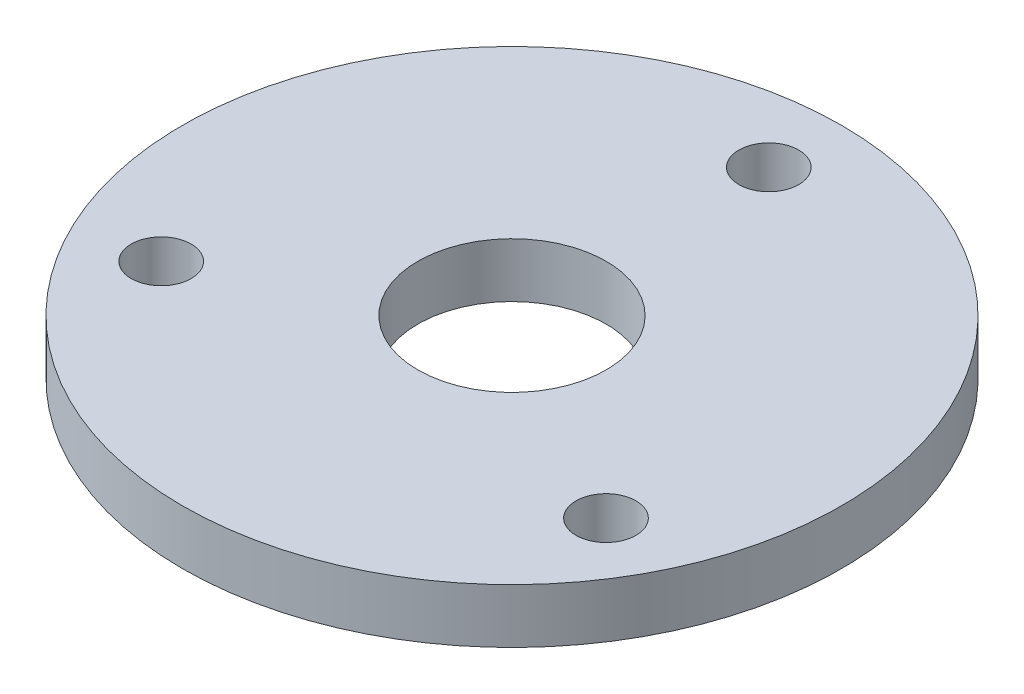
ISO-10303-21;
HEADER;
FILE_DESCRIPTION(('STEP AP214'),'2;1');
FILE_NAME('part.step','',(''),(''),'','','');
FILE_SCHEMA(('AUTOMOTIVE_DESIGN { 1 0 10303 214 1 1 1 1 }'));
ENDSEC;
DATA;
#1=APPLICATION_CONTEXT('core data for automotive mechanical design processes');
#2=APPLICATION_PROTOCOL_DEFINITION('international standard','automotive_design',2000,#1);
#3=PRODUCT_CONTEXT('',#1,'mechanical');
#4=PRODUCT('Part','Part','',(#3));
#5=PRODUCT_RELATED_PRODUCT_CATEGORY('part','',(#4));
#6=PRODUCT_DEFINITION_FORMATION('','',#4);
#7=PRODUCT_DEFINITION_CONTEXT('part definition',#1,'design');
#8=PRODUCT_DEFINITION('design','',#6,#7);
#9=PRODUCT_DEFINITION_SHAPE('','',#8);
#10=(LENGTH_UNIT() NAMED_UNIT(*) SI_UNIT(.MILLI.,.METRE.));
#11=(NAMED_UNIT(*) PLANE_ANGLE_UNIT() SI_UNIT($,.RADIAN.));
#12=(NAMED_UNIT(*) SI_UNIT($,.STERADIAN.) SOLID_ANGLE_UNIT());
#13=UNCERTAINTY_MEASURE_WITH_UNIT(LENGTH_MEASURE(1.E-05),#10,'distance_accuracy_value','');
#14=(GEOMETRIC_REPRESENTATION_CONTEXT(3) GLOBAL_UNCERTAINTY_ASSIGNED_CONTEXT((#13)) GLOBAL_UNIT_ASSIGNED_CONTEXT((#10,
#11,#12)) REPRESENTATION_CONTEXT('',''));
#15=CARTESIAN_POINT('',(0.,0.,0.));
#16=DIRECTION('',(0.,0.,1.));
#17=DIRECTION('',(1.,0.,0.));
#18=AXIS2_PLACEMENT_3D('',#15,#16,#17);
#19=CARTESIAN_POINT('',(933.152542372881,6.36,-445.016949152542));
#20=DIRECTION('',(0.,-1.,0.));
#21=DIRECTION('',(0.,0.,-1.));
#22=AXIS2_PLACEMENT_3D('',#19,#20,#21);
#23=CYLINDRICAL_SURFACE('',#22,38.4999999999999);
#24=CARTESIAN_POINT('',(933.152542372881,6.36,-445.016949152542));
#25=DIRECTION('',(0.,1.,0.));
#26=DIRECTION('',(0.,0.,1.));
#27=AXIS2_PLACEMENT_3D('',#24,#25,#26);
#28=CIRCLE('',#27,38.4999999999999);
#29=CARTESIAN_POINT('',(933.152542372881,6.36,-483.516949152542));
#30=VERTEX_POINT('',#29);
#31=EDGE_CURVE('E10',#30,#30,#28,.T.);
#32=CARTESIAN_POINT('',(933.152542372881,0.,-445.016949152542));
#33=DIRECTION('',(0.,1.,0.));
#34=DIRECTION('',(0.,0.,1.));
#35=AXIS2_PLACEMENT_3D('',#32,#33,#34);
#36=CIRCLE('',#35,38.4999999999999);
#37=CARTESIAN_POINT('',(933.152542372881,0.,-483.516949152542));
#38=VERTEX_POINT('',#37);
#39=EDGE_CURVE('E40',#38,#38,#36,.T.);
#40=CARTESIAN_POINT('',(933.152542372881,6.36,-483.516949152542));
#41=CARTESIAN_POINT('',(933.152542372881,6.29375,-483.516949152542));
#42=CARTESIAN_POINT('',(933.152542372881,6.2275,-483.516949152542));
#43=CARTESIAN_POINT('',(933.152542372881,6.095,-483.516949152542));
#44=CARTESIAN_POINT('',(933.152542372881,6.02875,-483.516949152542));
#45=CARTESIAN_POINT('',(933.152542372881,5.89625,-483.516949152542));
#46=CARTESIAN_POINT('',(933.152542372881,5.83,-483.516949152542));
#47=CARTESIAN_POINT('',(933.152542372881,5.6975,-483.516949152542));
#48=CARTESIAN_POINT('',(933.152542372881,5.63125,-483.516949152542));
#49=CARTESIAN_POINT('',(933.152542372881,5.49875,-483.516949152542));
#50=CARTESIAN_POINT('',(933.152542372881,5.4325,-483.516949152542));
#51=CARTESIAN_POINT('',(933.152542372881,5.3,-483.516949152542));
#52=CARTESIAN_POINT('',(933.152542372881,5.23375,-483.516949152542));
#53=CARTESIAN_POINT('',(933.152542372881,5.10125,-483.516949152542));
#54=CARTESIAN_POINT('',(933.152542372881,5.035,-483.516949152542));
#55=CARTESIAN_POINT('',(933.152542372881,4.9025,-483.516949152542));
#56=CARTESIAN_POINT('',(933.152542372881,4.83625,-483.516949152542));
#57=CARTESIAN_POINT('',(933.152542372881,4.70375,-483.516949152542));
#58=CARTESIAN_POINT('',(933.152542372881,4.6375,-483.516949152542));
#59=CARTESIAN_POINT('',(933.152542372881,4.505,-483.516949152542));
#60=CARTESIAN_POINT('',(933.152542372881,4.43875,-483.516949152542));
#61=CARTESIAN_POINT('',(933.152542372881,4.30625,-483.516949152542));
#62=CARTESIAN_POINT('',(933.152542372881,4.24,-483.516949152542));
#63=CARTESIAN_POINT('',(933.152542372881,4.1075,-483.516949152542));
#64=CARTESIAN_POINT('',(933.152542372881,4.04125,-483.516949152542));
#65=CARTESIAN_POINT('',(933.152542372881,3.90875,-483.516949152542));
#66=CARTESIAN_POINT('',(933.152542372881,3.8425,-483.516949152542));
#67=CARTESIAN_POINT('',(933.152542372881,3.71,-483.516949152542));
#68=CARTESIAN_POINT('',(933.152542372881,3.64375,-483.516949152542));
#69=CARTESIAN_POINT('',(933.152542372881,3.51125,-483.516949152542));
#70=CARTESIAN_POINT('',(933.152542372881,3.445,-483.516949152542));
#71=CARTESIAN_POINT('',(933.152542372881,3.3125,-483.516949152542));
#72=CARTESIAN_POINT('',(933.152542372881,3.24625,-483.516949152542));
#73=CARTESIAN_POINT('',(933.152542372881,3.11375,-483.516949152542));
#74=CARTESIAN_POINT('',(933.152542372881,3.0475,-483.516949152542));
#75=CARTESIAN_POINT('',(933.152542372881,2.915,-483.516949152542));
#76=CARTESIAN_POINT('',(933.152542372881,2.84875,-483.516949152542));
#77=CARTESIAN_POINT('',(933.152542372881,2.71625,-483.516949152542));
#78=CARTESIAN_POINT('',(933.152542372881,2.65,-483.516949152542));
#79=CARTESIAN_POINT('',(933.152542372881,2.5175,-483.516949152542));
#80=CARTESIAN_POINT('',(933.152542372881,2.45125,-483.516949152542));
#81=CARTESIAN_POINT('',(933.152542372881,2.31875,-483.516949152542));
#82=CARTESIAN_POINT('',(933.152542372881,2.2525,-483.516949152542));
#83=CARTESIAN_POINT('',(933.152542372881,2.12,-483.516949152542));
#84=CARTESIAN_POINT('',(933.152542372881,2.05375,-483.516949152542));
#85=CARTESIAN_POINT('',(933.152542372881,1.92125,-483.516949152542));
#86=CARTESIAN_POINT('',(933.152542372881,1.855,-483.516949152542));
#87=CARTESIAN_POINT('',(933.152542372881,1.7225,-483.516949152542));
#88=CARTESIAN_POINT('',(933.152542372881,1.65625,-483.516949152542));
#89=CARTESIAN_POINT('',(933.152542372881,1.52375,-483.516949152542));
#90=CARTESIAN_POINT('',(933.152542372881,1.4575,-483.516949152542));
#91=CARTESIAN_POINT('',(933.152542372881,1.325,-483.516949152542));
#92=CARTESIAN_POINT('',(933.152542372881,1.25875,-483.516949152542));
#93=CARTESIAN_POINT('',(933.152542372881,1.12625,-483.516949152542));
#94=CARTESIAN_POINT('',(933.152542372881,1.06,-483.516949152542));
#95=CARTESIAN_POINT('',(933.152542372881,0.9275,-483.516949152542));
#96=CARTESIAN_POINT('',(933.152542372881,0.86125,-483.516949152542));
#97=CARTESIAN_POINT('',(933.152542372881,0.72875,-483.516949152542));
#98=CARTESIAN_POINT('',(933.152542372881,0.6625,-483.516949152542));
#99=CARTESIAN_POINT('',(933.152542372881,0.53,-483.516949152542));
#100=CARTESIAN_POINT('',(933.152542372881,0.46375,-483.516949152542));
#101=CARTESIAN_POINT('',(933.152542372881,0.33125,-483.516949152542));
#102=CARTESIAN_POINT('',(933.152542372881,0.265,-483.516949152542));
#103=CARTESIAN_POINT('',(933.152542372881,0.1325,-483.516949152542));
#104=CARTESIAN_POINT('',(933.152542372881,0.0662500000000001,-483.516949152542));
#105=CARTESIAN_POINT('',(933.152542372881,0.,-483.516949152542));
#106=B_SPLINE_CURVE_WITH_KNOTS('',3,(#40,#41,#42,#43,#44,#45,#46,#47,#48,#49,#50,#51,#52,#53,
#54,#55,#56,#57,#58,#59,#60,#61,#62,#63,#64,#65,#66,#67,#68,#69,#70,#71,#72,#73,#74,#75,#76,#77,
#78,#79,#80,#81,#82,#83,#84,#85,#86,#87,#88,#89,#90,#91,#92,#93,#94,#95,#96,#97,#98,#99,#100,
#101,#102,#103,#104,#105),.UNSPECIFIED.,.F.,.F.,(4,2,2,2,2,2,2,2,2,2,2,2,2,2,2,2,2,2,2,2,2,2,2,
2,2,2,2,2,2,2,2,2,4),(0.,0.198749999999999,0.397499999999999,0.59625,0.795,0.99375,1.1925,
1.39125,1.59,1.78875,1.9875,2.18625,2.385,2.58375,2.7825,2.98125,3.18,3.37875,3.5775,3.77625,
3.975,4.17375,4.3725,4.57125,4.77,4.96875,5.1675,5.36625,5.565,5.76375,5.9625,6.16125,6.36),.UNSPECIFIED.);
#107=EDGE_CURVE('BSEAM37',#30,#38,#106,.T.);
#108=ORIENTED_EDGE('',*,*,#31,.F.);
#109=ORIENTED_EDGE('',*,*,#39,.T.);
#110=ORIENTED_EDGE('',*,*,#107,.T.);
#111=ORIENTED_EDGE('',*,*,#107,.F.);
#112=EDGE_LOOP('',(#108,#110,#109,#111));
#113=FACE_BOUND('',#112,.T.);
#114=ADVANCED_FACE('F37',(#113),#23,.T.);
#115=CARTESIAN_POINT('',(933.152542372881,6.36,-445.016949152542));
#116=DIRECTION('',(0.,1.,0.));
#117=DIRECTION('',(0.,0.,1.));
#118=AXIS2_PLACEMENT_3D('',#115,#116,#117);
#119=PLANE('',#118);
#120=CARTESIAN_POINT('',(933.152542372881,6.36,-445.016949152542));
#121=DIRECTION('',(0.,1.,0.));
#122=DIRECTION('',(0.,0.,1.));
#123=AXIS2_PLACEMENT_3D('',#120,#121,#122);
#124=CIRCLE('',#123,11.);
#125=CARTESIAN_POINT('',(933.152542372881,6.36,-434.016949152542));
#126=VERTEX_POINT('',#125);
#127=EDGE_CURVE('E75',#126,#126,#124,.T.);
#128=ORIENTED_EDGE('',*,*,#127,.F.);
#129=EDGE_LOOP('',(#128));
#130=FACE_BOUND('',#129,.T.);
#131=CARTESIAN_POINT('',(907.171780259348,6.36,-430.016949152542));
#132=DIRECTION('',(0.,1.,0.));
#133=DIRECTION('',(0.,0.,1.));
#134=AXIS2_PLACEMENT_3D('',#131,#132,#133);
#135=CIRCLE('',#134,3.49999999999985);
#136=CARTESIAN_POINT('',(907.171780259348,6.36,-426.516949152543));
#137=VERTEX_POINT('',#136);
#138=EDGE_CURVE('E59',#137,#137,#135,.T.);
#139=ORIENTED_EDGE('',*,*,#138,.F.);
#140=EDGE_LOOP('',(#139));
#141=FACE_BOUND('',#140,.T.);
#142=CARTESIAN_POINT('',(959.133304486414,6.36,-430.016949152542));
#143=DIRECTION('',(0.,1.,0.));
#144=DIRECTION('',(0.,0.,1.));
#145=AXIS2_PLACEMENT_3D('',#142,#143,#144);
#146=CIRCLE('',#145,3.49999999999997);
#147=CARTESIAN_POINT('',(959.133304486414,6.36,-426.516949152543));
#148=VERTEX_POINT('',#147);
#149=EDGE_CURVE('E68',#148,#148,#146,.T.);
#150=ORIENTED_EDGE('',*,*,#149,.F.);
#151=EDGE_LOOP('',(#150));
#152=FACE_BOUND('',#151,.T.);
#153=CARTESIAN_POINT('',(933.152542372881,6.36,-475.016949152542));
#154=DIRECTION('',(0.,1.,0.));
#155=DIRECTION('',(0.,0.,1.));
#156=AXIS2_PLACEMENT_3D('',#153,#154,#155);
#157=CIRCLE('',#156,3.49999999999997);
#158=CARTESIAN_POINT('',(933.152542372881,6.36,-471.516949152543));
#159=VERTEX_POINT('',#158);
#160=EDGE_CURVE('E51',#159,#159,#157,.T.);
#161=ORIENTED_EDGE('',*,*,#160,.F.);
#162=EDGE_LOOP('',(#161));
#163=FACE_BOUND('',#162,.T.);
#164=ORIENTED_EDGE('',*,*,#31,.T.);
#165=EDGE_LOOP('',(#164));
#166=FACE_BOUND('',#165,.T.);
#167=ADVANCED_FACE('F93',(#130,#141,#152,#163,#166),#119,.T.);
#168=CARTESIAN_POINT('',(933.152542372881,0.,-445.016949152542));
#169=DIRECTION('',(0.,1.,0.));
#170=DIRECTION('',(0.,0.,1.));
#171=AXIS2_PLACEMENT_3D('',#168,#169,#170);
#172=PLANE('',#171);
#173=CARTESIAN_POINT('',(933.152542372881,0.,-445.016949152542));
#174=DIRECTION('',(0.,1.,0.));
#175=DIRECTION('',(0.,0.,1.));
#176=AXIS2_PLACEMENT_3D('',#173,#174,#175);
#177=CIRCLE('',#176,11.);
#178=CARTESIAN_POINT('',(933.152542372881,0.,-434.016949152542));
#179=VERTEX_POINT('',#178);
#180=EDGE_CURVE('E64',#179,#179,#177,.T.);
#181=ORIENTED_EDGE('',*,*,#180,.T.);
#182=EDGE_LOOP('',(#181));
#183=FACE_BOUND('',#182,.T.);
#184=CARTESIAN_POINT('',(907.171780259348,0.,-430.016949152542));
#185=DIRECTION('',(0.,1.,0.));
#186=DIRECTION('',(0.,0.,1.));
#187=AXIS2_PLACEMENT_3D('',#184,#185,#186);
#188=CIRCLE('',#187,3.49999999999985);
#189=CARTESIAN_POINT('',(907.171780259348,0.,-426.516949152543));
#190=VERTEX_POINT('',#189);
#191=EDGE_CURVE('E63',#190,#190,#188,.T.);
#192=ORIENTED_EDGE('',*,*,#191,.T.);
#193=EDGE_LOOP('',(#192));
#194=FACE_BOUND('',#193,.T.);
#195=CARTESIAN_POINT('',(959.133304486414,0.,-430.016949152542));
#196=DIRECTION('',(0.,1.,0.));
#197=DIRECTION('',(0.,0.,1.));
#198=AXIS2_PLACEMENT_3D('',#195,#196,#197);
#199=CIRCLE('',#198,3.49999999999997);
#200=CARTESIAN_POINT('',(959.133304486414,0.,-426.516949152543));
#201=VERTEX_POINT('',#200);
#202=EDGE_CURVE('E55',#201,#201,#199,.T.);
#203=ORIENTED_EDGE('',*,*,#202,.T.);
#204=EDGE_LOOP('',(#203));
#205=FACE_BOUND('',#204,.T.);
#206=CARTESIAN_POINT('',(933.152542372881,0.,-475.016949152542));
#207=DIRECTION('',(0.,1.,0.));
#208=DIRECTION('',(0.,0.,1.));
#209=AXIS2_PLACEMENT_3D('',#206,#207,#208);
#210=CIRCLE('',#209,3.49999999999997);
#211=CARTESIAN_POINT('',(933.152542372881,0.,-471.516949152543));
#212=VERTEX_POINT('',#211);
#213=EDGE_CURVE('E49',#212,#212,#210,.T.);
#214=ORIENTED_EDGE('',*,*,#213,.T.);
#215=EDGE_LOOP('',(#214));
#216=FACE_BOUND('',#215,.T.);
#217=ORIENTED_EDGE('',*,*,#39,.F.);
#218=EDGE_LOOP('',(#217));
#219=FACE_BOUND('',#218,.T.);
#220=ADVANCED_FACE('F83',(#183,#194,#205,#216,#219),#172,.F.);
#221=CARTESIAN_POINT('',(933.152542372881,0.,-475.016949152542));
#222=DIRECTION('',(0.,1.,0.));
#223=DIRECTION('',(0.,0.,1.));
#224=AXIS2_PLACEMENT_3D('',#221,#222,#223);
#225=CYLINDRICAL_SURFACE('',#224,3.49999999999997);
#226=CARTESIAN_POINT('',(933.152542372881,0.,-471.516949152543));
#227=CARTESIAN_POINT('',(933.152542372881,0.0662499999999999,-471.516949152543));
#228=CARTESIAN_POINT('',(933.152542372881,0.1325,-471.516949152543));
#229=CARTESIAN_POINT('',(933.152542372881,0.265,-471.516949152543));
#230=CARTESIAN_POINT('',(933.152542372881,0.33125,-471.516949152543));
#231=CARTESIAN_POINT('',(933.152542372881,0.46375,-471.516949152543));
#232=CARTESIAN_POINT('',(933.152542372881,0.53,-471.516949152543));
#233=CARTESIAN_POINT('',(933.152542372881,0.6625,-471.516949152543));
#234=CARTESIAN_POINT('',(933.152542372881,0.72875,-471.516949152543));
#235=CARTESIAN_POINT('',(933.152542372881,0.86125,-471.516949152543));
#236=CARTESIAN_POINT('',(933.152542372881,0.9275,-471.516949152543));
#237=CARTESIAN_POINT('',(933.152542372881,1.06,-471.516949152543));
#238=CARTESIAN_POINT('',(933.152542372881,1.12625,-471.516949152543));
#239=CARTESIAN_POINT('',(933.152542372881,1.25875,-471.516949152543));
#240=CARTESIAN_POINT('',(933.152542372881,1.325,-471.516949152543));
#241=CARTESIAN_POINT('',(933.152542372881,1.4575,-471.516949152543));
#242=CARTESIAN_POINT('',(933.152542372881,1.52375,-471.516949152543));
#243=CARTESIAN_POINT('',(933.152542372881,1.65625,-471.516949152543));
#244=CARTESIAN_POINT('',(933.152542372881,1.7225,-471.516949152543));
#245=CARTESIAN_POINT('',(933.152542372881,1.855,-471.516949152543));
#246=CARTESIAN_POINT('',(933.152542372881,1.92125,-471.516949152543));
#247=CARTESIAN_POINT('',(933.152542372881,2.05375,-471.516949152543));
#248=CARTESIAN_POINT('',(933.152542372881,2.12,-471.516949152543));
#249=CARTESIAN_POINT('',(933.152542372881,2.2525,-471.516949152543));
#250=CARTESIAN_POINT('',(933.152542372881,2.31875,-471.516949152543));
#251=CARTESIAN_POINT('',(933.152542372881,2.45125,-471.516949152543));
#252=CARTESIAN_POINT('',(933.152542372881,2.5175,-471.516949152543));
#253=CARTESIAN_POINT('',(933.152542372881,2.65,-471.516949152543));
#254=CARTESIAN_POINT('',(933.152542372881,2.71625,-471.516949152543));
#255=CARTESIAN_POINT('',(933.152542372881,2.84875,-471.516949152543));
#256=CARTESIAN_POINT('',(933.152542372881,2.915,-471.516949152543));
#257=CARTESIAN_POINT('',(933.152542372881,3.0475,-471.516949152543));
#258=CARTESIAN_POINT('',(933.152542372881,3.11375,-471.516949152543));
#259=CARTESIAN_POINT('',(933.152542372881,3.24625,-471.516949152543));
#260=CARTESIAN_POINT('',(933.152542372881,3.3125,-471.516949152543));
#261=CARTESIAN_POINT('',(933.152542372881,3.445,-471.516949152543));
#262=CARTESIAN_POINT('',(933.152542372881,3.51125,-471.516949152543));
#263=CARTESIAN_POINT('',(933.152542372881,3.64375,-471.516949152543));
#264=CARTESIAN_POINT('',(933.152542372881,3.71,-471.516949152543));
#265=CARTESIAN_POINT('',(933.152542372881,3.8425,-471.516949152543));
#266=CARTESIAN_POINT('',(933.152542372881,3.90875,-471.516949152543));
#267=CARTESIAN_POINT('',(933.152542372881,4.04125,-471.516949152543));
#268=CARTESIAN_POINT('',(933.152542372881,4.1075,-471.516949152543));
#269=CARTESIAN_POINT('',(933.152542372881,4.24,-471.516949152543));
#270=CARTESIAN_POINT('',(933.152542372881,4.30625,-471.516949152543));
#271=CARTESIAN_POINT('',(933.152542372881,4.43875,-471.516949152543));
#272=CARTESIAN_POINT('',(933.152542372881,4.505,-471.516949152543));
#273=CARTESIAN_POINT('',(933.152542372881,4.6375,-471.516949152543));
#274=CARTESIAN_POINT('',(933.152542372881,4.70375,-471.516949152543));
#275=CARTESIAN_POINT('',(933.152542372881,4.83625,-471.516949152543));
#276=CARTESIAN_POINT('',(933.152542372881,4.9025,-471.516949152543));
#277=CARTESIAN_POINT('',(933.152542372881,5.035,-471.516949152543));
#278=CARTESIAN_POINT('',(933.152542372881,5.10125,-471.516949152543));
#279=CARTESIAN_POINT('',(933.152542372881,5.23375,-471.516949152543));
#280=CARTESIAN_POINT('',(933.152542372881,5.3,-471.516949152543));
#281=CARTESIAN_POINT('',(933.152542372881,5.4325,-471.516949152543));
#282=CARTESIAN_POINT('',(933.152542372881,5.49875,-471.516949152543));
#283=CARTESIAN_POINT('',(933.152542372881,5.63125,-471.516949152543));
#284=CARTESIAN_POINT('',(933.152542372881,5.6975,-471.516949152543));
#285=CARTESIAN_POINT('',(933.152542372881,5.83,-471.516949152543));
#286=CARTESIAN_POINT('',(933.152542372881,5.89625,-471.516949152543));
#287=CARTESIAN_POINT('',(933.152542372881,6.02875,-471.516949152543));
#288=CARTESIAN_POINT('',(933.152542372881,6.095,-471.516949152543));
#289=CARTESIAN_POINT('',(933.152542372881,6.2275,-471.516949152543));
#290=CARTESIAN_POINT('',(933.152542372881,6.29375,-471.516949152543));
#291=CARTESIAN_POINT('',(933.152542372881,6.36,-471.516949152543));
#292=B_SPLINE_CURVE_WITH_KNOTS('',3,(#226,#227,#228,#229,#230,#231,#232,#233,#234,#235,#236,
#237,#238,#239,#240,#241,#242,#243,#244,#245,#246,#247,#248,#249,#250,#251,#252,#253,#254,#255,
#256,#257,#258,#259,#260,#261,#262,#263,#264,#265,#266,#267,#268,#269,#270,#271,#272,#273,#274,
#275,#276,#277,#278,#279,#280,#281,#282,#283,#284,#285,#286,#287,#288,#289,#290,#291),
.UNSPECIFIED.,.F.,.F.,(4,2,2,2,2,2,2,2,2,2,2,2,2,2,2,2,2,2,2,2,2,2,2,2,2,2,2,2,2,2,2,2,4),(0.,
0.19875,0.3975,0.59625,0.795,0.99375,1.1925,1.39125,1.59,1.78875,1.9875,2.18625,2.385,2.58375,
2.7825,2.98125,3.18,3.37875,3.5775,3.77625,3.975,4.17375,4.3725,4.57125,4.77,4.96875,5.1675,
5.36625,5.565,5.76375,5.9625,6.16125,6.36),.UNSPECIFIED.);
#293=EDGE_CURVE('BSEAM103',#212,#159,#292,.T.);
#294=ORIENTED_EDGE('',*,*,#213,.F.);
#295=ORIENTED_EDGE('',*,*,#160,.T.);
#296=ORIENTED_EDGE('',*,*,#293,.T.);
#297=ORIENTED_EDGE('',*,*,#293,.F.);
#298=EDGE_LOOP('',(#294,#296,#295,#297));
#299=FACE_BOUND('',#298,.T.);
#300=ADVANCED_FACE('F103',(#299),#225,.F.);
#301=CARTESIAN_POINT('',(959.133304486414,0.,-430.016949152542));
#302=DIRECTION('',(0.,1.,0.));
#303=DIRECTION('',(0.,0.,1.));
#304=AXIS2_PLACEMENT_3D('',#301,#302,#303);
#305=CYLINDRICAL_SURFACE('',#304,3.49999999999997);
#306=CARTESIAN_POINT('',(959.133304486414,0.,-426.516949152543));
#307=CARTESIAN_POINT('',(959.133304486414,0.0662499999999999,-426.516949152543));
#308=CARTESIAN_POINT('',(959.133304486414,0.1325,-426.516949152543));
#309=CARTESIAN_POINT('',(959.133304486414,0.265,-426.516949152543));
#310=CARTESIAN_POINT('',(959.133304486414,0.33125,-426.516949152543));
#311=CARTESIAN_POINT('',(959.133304486414,0.46375,-426.516949152543));
#312=CARTESIAN_POINT('',(959.133304486414,0.53,-426.516949152543));
#313=CARTESIAN_POINT('',(959.133304486414,0.6625,-426.516949152543));
#314=CARTESIAN_POINT('',(959.133304486414,0.72875,-426.516949152543));
#315=CARTESIAN_POINT('',(959.133304486414,0.86125,-426.516949152543));
#316=CARTESIAN_POINT('',(959.133304486414,0.9275,-426.516949152543));
#317=CARTESIAN_POINT('',(959.133304486414,1.06,-426.516949152543));
#318=CARTESIAN_POINT('',(959.133304486414,1.12625,-426.516949152543));
#319=CARTESIAN_POINT('',(959.133304486414,1.25875,-426.516949152543));
#320=CARTESIAN_POINT('',(959.133304486414,1.325,-426.516949152543));
#321=CARTESIAN_POINT('',(959.133304486414,1.4575,-426.516949152543));
#322=CARTESIAN_POINT('',(959.133304486414,1.52375,-426.516949152543));
#323=CARTESIAN_POINT('',(959.133304486414,1.65625,-426.516949152543));
#324=CARTESIAN_POINT('',(959.133304486414,1.7225,-426.516949152543));
#325=CARTESIAN_POINT('',(959.133304486414,1.855,-426.516949152543));
#326=CARTESIAN_POINT('',(959.133304486414,1.92125,-426.516949152543));
#327=CARTESIAN_POINT('',(959.133304486414,2.05375,-426.516949152543));
#328=CARTESIAN_POINT('',(959.133304486414,2.12,-426.516949152543));
#329=CARTESIAN_POINT('',(959.133304486414,2.2525,-426.516949152543));
#330=CARTESIAN_POINT('',(959.133304486414,2.31875,-426.516949152543));
#331=CARTESIAN_POINT('',(959.133304486414,2.45125,-426.516949152543));
#332=CARTESIAN_POINT('',(959.133304486414,2.5175,-426.516949152543));
#333=CARTESIAN_POINT('',(959.133304486414,2.65,-426.516949152543));
#334=CARTESIAN_POINT('',(959.133304486414,2.71625,-426.516949152543));
#335=CARTESIAN_POINT('',(959.133304486414,2.84875,-426.516949152543));
#336=CARTESIAN_POINT('',(959.133304486414,2.915,-426.516949152543));
#337=CARTESIAN_POINT('',(959.133304486414,3.0475,-426.516949152543));
#338=CARTESIAN_POINT('',(959.133304486414,3.11375,-426.516949152543));
#339=CARTESIAN_POINT('',(959.133304486414,3.24625,-426.516949152543));
#340=CARTESIAN_POINT('',(959.133304486414,3.3125,-426.516949152543));
#341=CARTESIAN_POINT('',(959.133304486414,3.445,-426.516949152543));
#342=CARTESIAN_POINT('',(959.133304486414,3.51125,-426.516949152543));
#343=CARTESIAN_POINT('',(959.133304486414,3.64375,-426.516949152543));
#344=CARTESIAN_POINT('',(959.133304486414,3.71,-426.516949152543));
#345=CARTESIAN_POINT('',(959.133304486414,3.8425,-426.516949152543));
#346=CARTESIAN_POINT('',(959.133304486414,3.90875,-426.516949152543));
#347=CARTESIAN_POINT('',(959.133304486414,4.04125,-426.516949152543));
#348=CARTESIAN_POINT('',(959.133304486414,4.1075,-426.516949152543));
#349=CARTESIAN_POINT('',(959.133304486414,4.24,-426.516949152543));
#350=CARTESIAN_POINT('',(959.133304486414,4.30625,-426.516949152543));
#351=CARTESIAN_POINT('',(959.133304486414,4.43875,-426.516949152543));
#352=CARTESIAN_POINT('',(959.133304486414,4.505,-426.516949152543));
#353=CARTESIAN_POINT('',(959.133304486414,4.6375,-426.516949152543));
#354=CARTESIAN_POINT('',(959.133304486414,4.70375,-426.516949152543));
#355=CARTESIAN_POINT('',(959.133304486414,4.83625,-426.516949152543));
#356=CARTESIAN_POINT('',(959.133304486414,4.9025,-426.516949152543));
#357=CARTESIAN_POINT('',(959.133304486414,5.035,-426.516949152543));
#358=CARTESIAN_POINT('',(959.133304486414,5.10125,-426.516949152543));
#359=CARTESIAN_POINT('',(959.133304486414,5.23375,-426.516949152543));
#360=CARTESIAN_POINT('',(959.133304486414,5.3,-426.516949152543));
#361=CARTESIAN_POINT('',(959.133304486414,5.4325,-426.516949152543));
#362=CARTESIAN_POINT('',(959.133304486414,5.49875,-426.516949152543));
#363=CARTESIAN_POINT('',(959.133304486414,5.63125,-426.516949152543));
#364=CARTESIAN_POINT('',(959.133304486414,5.6975,-426.516949152543));
#365=CARTESIAN_POINT('',(959.133304486414,5.83,-426.516949152543));
#366=CARTESIAN_POINT('',(959.133304486414,5.89625,-426.516949152543));
#367=CARTESIAN_POINT('',(959.133304486414,6.02875,-426.516949152543));
#368=CARTESIAN_POINT('',(959.133304486414,6.095,-426.516949152543));
#369=CARTESIAN_POINT('',(959.133304486414,6.2275,-426.516949152543));
#370=CARTESIAN_POINT('',(959.133304486414,6.29375,-426.516949152543));
#371=CARTESIAN_POINT('',(959.133304486414,6.36,-426.516949152543));
#372=B_SPLINE_CURVE_WITH_KNOTS('',3,(#306,#307,#308,#309,#310,#311,#312,#313,#314,#315,#316,
#317,#318,#319,#320,#321,#322,#323,#324,#325,#326,#327,#328,#329,#330,#331,#332,#333,#334,#335,
#336,#337,#338,#339,#340,#341,#342,#343,#344,#345,#346,#347,#348,#349,#350,#351,#352,#353,#354,
#355,#356,#357,#358,#359,#360,#361,#362,#363,#364,#365,#366,#367,#368,#369,#370,#371),
.UNSPECIFIED.,.F.,.F.,(4,2,2,2,2,2,2,2,2,2,2,2,2,2,2,2,2,2,2,2,2,2,2,2,2,2,2,2,2,2,2,2,4),(0.,
0.19875,0.3975,0.59625,0.795,0.99375,1.1925,1.39125,1.59,1.78875,1.9875,2.18625,2.385,2.58375,
2.7825,2.98125,3.18,3.37875,3.5775,3.77625,3.975,4.17375,4.3725,4.57125,4.77,4.96875,5.1675,
5.36625,5.565,5.76375,5.9625,6.16125,6.36),.UNSPECIFIED.);
#373=EDGE_CURVE('BSEAM105',#201,#148,#372,.T.);
#374=ORIENTED_EDGE('',*,*,#202,.F.);
#375=ORIENTED_EDGE('',*,*,#149,.T.);
#376=ORIENTED_EDGE('',*,*,#373,.T.);
#377=ORIENTED_EDGE('',*,*,#373,.F.);
#378=EDGE_LOOP('',(#374,#376,#375,#377));
#379=FACE_BOUND('',#378,.T.);
#380=ADVANCED_FACE('F105',(#379),#305,.F.);
#381=CARTESIAN_POINT('',(907.171780259348,0.,-430.016949152542));
#382=DIRECTION('',(0.,1.,0.));
#383=DIRECTION('',(0.,0.,1.));
#384=AXIS2_PLACEMENT_3D('',#381,#382,#383);
#385=CYLINDRICAL_SURFACE('',#384,3.49999999999985);
#386=CARTESIAN_POINT('',(907.171780259348,0.,-426.516949152543));
#387=CARTESIAN_POINT('',(907.171780259348,0.0662499999999999,-426.516949152543));
#388=CARTESIAN_POINT('',(907.171780259348,0.1325,-426.516949152543));
#389=CARTESIAN_POINT('',(907.171780259348,0.265,-426.516949152543));
#390=CARTESIAN_POINT('',(907.171780259348,0.33125,-426.516949152543));
#391=CARTESIAN_POINT('',(907.171780259348,0.46375,-426.516949152543));
#392=CARTESIAN_POINT('',(907.171780259348,0.53,-426.516949152543));
#393=CARTESIAN_POINT('',(907.171780259348,0.6625,-426.516949152543));
#394=CARTESIAN_POINT('',(907.171780259348,0.72875,-426.516949152543));
#395=CARTESIAN_POINT('',(907.171780259348,0.86125,-426.516949152543));
#396=CARTESIAN_POINT('',(907.171780259348,0.9275,-426.516949152543));
#397=CARTESIAN_POINT('',(907.171780259348,1.06,-426.516949152543));
#398=CARTESIAN_POINT('',(907.171780259348,1.12625,-426.516949152543));
#399=CARTESIAN_POINT('',(907.171780259348,1.25875,-426.516949152543));
#400=CARTESIAN_POINT('',(907.171780259348,1.325,-426.516949152543));
#401=CARTESIAN_POINT('',(907.171780259348,1.4575,-426.516949152543));
#402=CARTESIAN_POINT('',(907.171780259348,1.52375,-426.516949152543));
#403=CARTESIAN_POINT('',(907.171780259348,1.65625,-426.516949152543));
#404=CARTESIAN_POINT('',(907.171780259348,1.7225,-426.516949152543));
#405=CARTESIAN_POINT('',(907.171780259348,1.855,-426.516949152543));
#406=CARTESIAN_POINT('',(907.171780259348,1.92125,-426.516949152543));
#407=CARTESIAN_POINT('',(907.171780259348,2.05375,-426.516949152543));
#408=CARTESIAN_POINT('',(907.171780259348,2.12,-426.516949152543));
#409=CARTESIAN_POINT('',(907.171780259348,2.2525,-426.516949152543));
#410=CARTESIAN_POINT('',(907.171780259348,2.31875,-426.516949152543));
#411=CARTESIAN_POINT('',(907.171780259348,2.45125,-426.516949152543));
#412=CARTESIAN_POINT('',(907.171780259348,2.5175,-426.516949152543));
#413=CARTESIAN_POINT('',(907.171780259348,2.65,-426.516949152543));
#414=CARTESIAN_POINT('',(907.171780259348,2.71625,-426.516949152543));
#415=CARTESIAN_POINT('',(907.171780259348,2.84875,-426.516949152543));
#416=CARTESIAN_POINT('',(907.171780259348,2.915,-426.516949152543));
#417=CARTESIAN_POINT('',(907.171780259348,3.0475,-426.516949152543));
#418=CARTESIAN_POINT('',(907.171780259348,3.11375,-426.516949152543));
#419=CARTESIAN_POINT('',(907.171780259348,3.24625,-426.516949152543));
#420=CARTESIAN_POINT('',(907.171780259348,3.3125,-426.516949152543));
#421=CARTESIAN_POINT('',(907.171780259348,3.445,-426.516949152543));
#422=CARTESIAN_POINT('',(907.171780259348,3.51125,-426.516949152543));
#423=CARTESIAN_POINT('',(907.171780259348,3.64375,-426.516949152543));
#424=CARTESIAN_POINT('',(907.171780259348,3.71,-426.516949152543));
#425=CARTESIAN_POINT('',(907.171780259348,3.8425,-426.516949152543));
#426=CARTESIAN_POINT('',(907.171780259348,3.90875,-426.516949152543));
#427=CARTESIAN_POINT('',(907.171780259348,4.04125,-426.516949152543));
#428=CARTESIAN_POINT('',(907.171780259348,4.1075,-426.516949152543));
#429=CARTESIAN_POINT('',(907.171780259348,4.24,-426.516949152543));
#430=CARTESIAN_POINT('',(907.171780259348,4.30625,-426.516949152543));
#431=CARTESIAN_POINT('',(907.171780259348,4.43875,-426.516949152543));
#432=CARTESIAN_POINT('',(907.171780259348,4.505,-426.516949152543));
#433=CARTESIAN_POINT('',(907.171780259348,4.6375,-426.516949152543));
#434=CARTESIAN_POINT('',(907.171780259348,4.70375,-426.516949152543));
#435=CARTESIAN_POINT('',(907.171780259348,4.83625,-426.516949152543));
#436=CARTESIAN_POINT('',(907.171780259348,4.9025,-426.516949152543));
#437=CARTESIAN_POINT('',(907.171780259348,5.035,-426.516949152543));
#438=CARTESIAN_POINT('',(907.171780259348,5.10125,-426.516949152543));
#439=CARTESIAN_POINT('',(907.171780259348,5.23375,-426.516949152543));
#440=CARTESIAN_POINT('',(907.171780259348,5.3,-426.516949152543));
#441=CARTESIAN_POINT('',(907.171780259348,5.4325,-426.516949152543));
#442=CARTESIAN_POINT('',(907.171780259348,5.49875,-426.516949152543));
#443=CARTESIAN_POINT('',(907.171780259348,5.63125,-426.516949152543));
#444=CARTESIAN_POINT('',(907.171780259348,5.6975,-426.516949152543));
#445=CARTESIAN_POINT('',(907.171780259348,5.83,-426.516949152543));
#446=CARTESIAN_POINT('',(907.171780259348,5.89625,-426.516949152543));
#447=CARTESIAN_POINT('',(907.171780259348,6.02875,-426.516949152543));
#448=CARTESIAN_POINT('',(907.171780259348,6.095,-426.516949152543));
#449=CARTESIAN_POINT('',(907.171780259348,6.2275,-426.516949152543));
#450=CARTESIAN_POINT('',(907.171780259348,6.29375,-426.516949152543));
#451=CARTESIAN_POINT('',(907.171780259348,6.36,-426.516949152543));
#452=B_SPLINE_CURVE_WITH_KNOTS('',3,(#386,#387,#388,#389,#390,#391,#392,#393,#394,#395,#396,
#397,#398,#399,#400,#401,#402,#403,#404,#405,#406,#407,#408,#409,#410,#411,#412,#413,#414,#415,
#416,#417,#418,#419,#420,#421,#422,#423,#424,#425,#426,#427,#428,#429,#430,#431,#432,#433,#434,
#435,#436,#437,#438,#439,#440,#441,#442,#443,#444,#445,#446,#447,#448,#449,#450,#451),
.UNSPECIFIED.,.F.,.F.,(4,2,2,2,2,2,2,2,2,2,2,2,2,2,2,2,2,2,2,2,2,2,2,2,2,2,2,2,2,2,2,2,4),(0.,
0.19875,0.3975,0.59625,0.795,0.99375,1.1925,1.39125,1.59,1.78875,1.9875,2.18625,2.385,2.58375,
2.7825,2.98125,3.18,3.37875,3.5775,3.77625,3.975,4.17375,4.3725,4.57125,4.77,4.96875,5.1675,
5.36625,5.565,5.76375,5.9625,6.16125,6.36),.UNSPECIFIED.);
#453=EDGE_CURVE('BSEAM89',#190,#137,#452,.T.);
#454=ORIENTED_EDGE('',*,*,#191,.F.);
#455=ORIENTED_EDGE('',*,*,#138,.T.);
#456=ORIENTED_EDGE('',*,*,#453,.T.);
#457=ORIENTED_EDGE('',*,*,#453,.F.);
#458=EDGE_LOOP('',(#454,#456,#455,#457));
#459=FACE_BOUND('',#458,.T.);
#460=ADVANCED_FACE('F89',(#459),#385,.F.);
#461=CARTESIAN_POINT('',(933.152542372881,0.,-445.016949152542));
#462=DIRECTION('',(0.,1.,0.));
#463=DIRECTION('',(0.,0.,1.));
#464=AXIS2_PLACEMENT_3D('',#461,#462,#463);
#465=CYLINDRICAL_SURFACE('',#464,11.);
#466=CARTESIAN_POINT('',(933.152542372881,0.,-434.016949152542));
#467=CARTESIAN_POINT('',(933.152542372881,0.0662499999999999,-434.016949152542));
#468=CARTESIAN_POINT('',(933.152542372881,0.1325,-434.016949152542));
#469=CARTESIAN_POINT('',(933.152542372881,0.265,-434.016949152542));
#470=CARTESIAN_POINT('',(933.152542372881,0.33125,-434.016949152542));
#471=CARTESIAN_POINT('',(933.152542372881,0.46375,-434.016949152542));
#472=CARTESIAN_POINT('',(933.152542372881,0.53,-434.016949152542));
#473=CARTESIAN_POINT('',(933.152542372881,0.6625,-434.016949152542));
#474=CARTESIAN_POINT('',(933.152542372881,0.72875,-434.016949152542));
#475=CARTESIAN_POINT('',(933.152542372881,0.86125,-434.016949152542));
#476=CARTESIAN_POINT('',(933.152542372881,0.9275,-434.016949152542));
#477=CARTESIAN_POINT('',(933.152542372881,1.06,-434.016949152542));
#478=CARTESIAN_POINT('',(933.152542372881,1.12625,-434.016949152542));
#479=CARTESIAN_POINT('',(933.152542372881,1.25875,-434.016949152542));
#480=CARTESIAN_POINT('',(933.152542372881,1.325,-434.016949152542));
#481=CARTESIAN_POINT('',(933.152542372881,1.4575,-434.016949152542));
#482=CARTESIAN_POINT('',(933.152542372881,1.52375,-434.016949152542));
#483=CARTESIAN_POINT('',(933.152542372881,1.65625,-434.016949152542));
#484=CARTESIAN_POINT('',(933.152542372881,1.7225,-434.016949152542));
#485=CARTESIAN_POINT('',(933.152542372881,1.855,-434.016949152542));
#486=CARTESIAN_POINT('',(933.152542372881,1.92125,-434.016949152542));
#487=CARTESIAN_POINT('',(933.152542372881,2.05375,-434.016949152542));
#488=CARTESIAN_POINT('',(933.152542372881,2.12,-434.016949152542));
#489=CARTESIAN_POINT('',(933.152542372881,2.2525,-434.016949152542));
#490=CARTESIAN_POINT('',(933.152542372881,2.31875,-434.016949152542));
#491=CARTESIAN_POINT('',(933.152542372881,2.45125,-434.016949152542));
#492=CARTESIAN_POINT('',(933.152542372881,2.5175,-434.016949152542));
#493=CARTESIAN_POINT('',(933.152542372881,2.65,-434.016949152542));
#494=CARTESIAN_POINT('',(933.152542372881,2.71625,-434.016949152542));
#495=CARTESIAN_POINT('',(933.152542372881,2.84875,-434.016949152542));
#496=CARTESIAN_POINT('',(933.152542372881,2.915,-434.016949152542));
#497=CARTESIAN_POINT('',(933.152542372881,3.0475,-434.016949152542));
#498=CARTESIAN_POINT('',(933.152542372881,3.11375,-434.016949152542));
#499=CARTESIAN_POINT('',(933.152542372881,3.24625,-434.016949152542));
#500=CARTESIAN_POINT('',(933.152542372881,3.3125,-434.016949152542));
#501=CARTESIAN_POINT('',(933.152542372881,3.445,-434.016949152542));
#502=CARTESIAN_POINT('',(933.152542372881,3.51125,-434.016949152542));
#503=CARTESIAN_POINT('',(933.152542372881,3.64375,-434.016949152542));
#504=CARTESIAN_POINT('',(933.152542372881,3.71,-434.016949152542));
#505=CARTESIAN_POINT('',(933.152542372881,3.8425,-434.016949152542));
#506=CARTESIAN_POINT('',(933.152542372881,3.90875,-434.016949152542));
#507=CARTESIAN_POINT('',(933.152542372881,4.04125,-434.016949152542));
#508=CARTESIAN_POINT('',(933.152542372881,4.1075,-434.016949152542));
#509=CARTESIAN_POINT('',(933.152542372881,4.24,-434.016949152542));
#510=CARTESIAN_POINT('',(933.152542372881,4.30625,-434.016949152542));
#511=CARTESIAN_POINT('',(933.152542372881,4.43875,-434.016949152542));
#512=CARTESIAN_POINT('',(933.152542372881,4.505,-434.016949152542));
#513=CARTESIAN_POINT('',(933.152542372881,4.6375,-434.016949152542));
#514=CARTESIAN_POINT('',(933.152542372881,4.70375,-434.016949152542));
#515=CARTESIAN_POINT('',(933.152542372881,4.83625,-434.016949152542));
#516=CARTESIAN_POINT('',(933.152542372881,4.9025,-434.016949152542));
#517=CARTESIAN_POINT('',(933.152542372881,5.035,-434.016949152542));
#518=CARTESIAN_POINT('',(933.152542372881,5.10125,-434.016949152542));
#519=CARTESIAN_POINT('',(933.152542372881,5.23375,-434.016949152542));
#520=CARTESIAN_POINT('',(933.152542372881,5.3,-434.016949152542));
#521=CARTESIAN_POINT('',(933.152542372881,5.4325,-434.016949152542));
#522=CARTESIAN_POINT('',(933.152542372881,5.49875,-434.016949152542));
#523=CARTESIAN_POINT('',(933.152542372881,5.63125,-434.016949152542));
#524=CARTESIAN_POINT('',(933.152542372881,5.6975,-434.016949152542));
#525=CARTESIAN_POINT('',(933.152542372881,5.83,-434.016949152542));
#526=CARTESIAN_POINT('',(933.152542372881,5.89625,-434.016949152542));
#527=CARTESIAN_POINT('',(933.152542372881,6.02875,-434.016949152542));
#528=CARTESIAN_POINT('',(933.152542372881,6.095,-434.016949152542));
#529=CARTESIAN_POINT('',(933.152542372881,6.2275,-434.016949152542));
#530=CARTESIAN_POINT('',(933.152542372881,6.29375,-434.016949152542));
#531=CARTESIAN_POINT('',(933.152542372881,6.36,-434.016949152542));
#532=B_SPLINE_CURVE_WITH_KNOTS('',3,(#466,#467,#468,#469,#470,#471,#472,#473,#474,#475,#476,
#477,#478,#479,#480,#481,#482,#483,#484,#485,#486,#487,#488,#489,#490,#491,#492,#493,#494,#495,
#496,#497,#498,#499,#500,#501,#502,#503,#504,#505,#506,#507,#508,#509,#510,#511,#512,#513,#514,
#515,#516,#517,#518,#519,#520,#521,#522,#523,#524,#525,#526,#527,#528,#529,#530,#531),
.UNSPECIFIED.,.F.,.F.,(4,2,2,2,2,2,2,2,2,2,2,2,2,2,2,2,2,2,2,2,2,2,2,2,2,2,2,2,2,2,2,2,4),(0.,
0.19875,0.3975,0.59625,0.795,0.99375,1.1925,1.39125,1.59,1.78875,1.9875,2.18625,2.385,2.58375,
2.7825,2.98125,3.18,3.37875,3.5775,3.77625,3.975,4.17375,4.3725,4.57125,4.77,4.96875,5.1675,
5.36625,5.565,5.76375,5.9625,6.16125,6.36),.UNSPECIFIED.);
#533=EDGE_CURVE('BSEAM86',#179,#126,#532,.T.);
#534=ORIENTED_EDGE('',*,*,#180,.F.);
#535=ORIENTED_EDGE('',*,*,#127,.T.);
#536=ORIENTED_EDGE('',*,*,#533,.T.);
#537=ORIENTED_EDGE('',*,*,#533,.F.);
#538=EDGE_LOOP('',(#534,#536,#535,#537));
#539=FACE_BOUND('',#538,.T.);
#540=ADVANCED_FACE('F86',(#539),#465,.F.);
#541=CLOSED_SHELL('',(#114,#167,#220,#300,#380,#460,#540));
#542=MANIFOLD_SOLID_BREP('B2',#541);
#543=ADVANCED_BREP_SHAPE_REPRESENTATION('',(#18,#542),#14);
#544=SHAPE_DEFINITION_REPRESENTATION(#9,#543);
ENDSEC;
END-ISO-10303-21;
